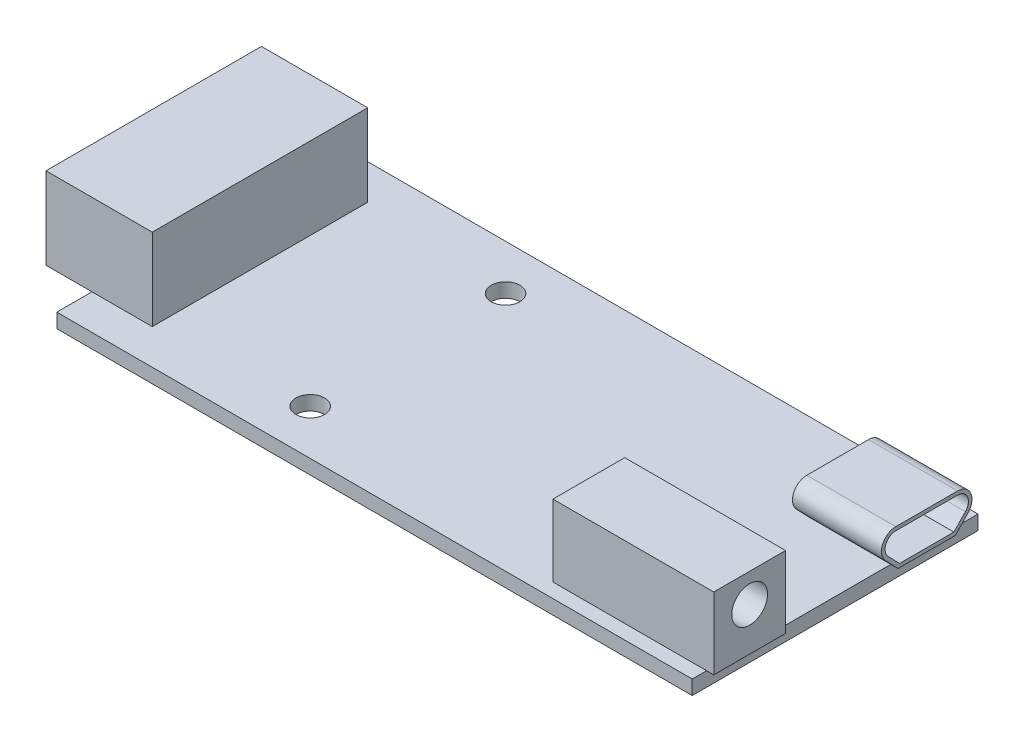
ISO-10303-21;
HEADER;
FILE_DESCRIPTION(('STEP AP214'),'2;1');
FILE_NAME('part.step','',(''),(''),'','','');
FILE_SCHEMA(('AUTOMOTIVE_DESIGN { 1 0 10303 214 1 1 1 1 }'));
ENDSEC;
DATA;
#1=APPLICATION_CONTEXT('core data for automotive mechanical design processes');
#2=APPLICATION_PROTOCOL_DEFINITION('international standard','automotive_design',2000,#1);
#3=PRODUCT_CONTEXT('',#1,'mechanical');
#4=PRODUCT('Part','Part','',(#3));
#5=PRODUCT_RELATED_PRODUCT_CATEGORY('part','',(#4));
#6=PRODUCT_DEFINITION_FORMATION('','',#4);
#7=PRODUCT_DEFINITION_CONTEXT('part definition',#1,'design');
#8=PRODUCT_DEFINITION('design','',#6,#7);
#9=PRODUCT_DEFINITION_SHAPE('','',#8);
#10=(LENGTH_UNIT() NAMED_UNIT(*) SI_UNIT(.MILLI.,.METRE.));
#11=(NAMED_UNIT(*) PLANE_ANGLE_UNIT() SI_UNIT($,.RADIAN.));
#12=(NAMED_UNIT(*) SI_UNIT($,.STERADIAN.) SOLID_ANGLE_UNIT());
#13=UNCERTAINTY_MEASURE_WITH_UNIT(LENGTH_MEASURE(1.E-05),#10,'distance_accuracy_value','');
#14=(GEOMETRIC_REPRESENTATION_CONTEXT(3) GLOBAL_UNCERTAINTY_ASSIGNED_CONTEXT((#13)) GLOBAL_UNIT_ASSIGNED_CONTEXT((#10,
#11,#12)) REPRESENTATION_CONTEXT('',''));
#15=CARTESIAN_POINT('',(0.,0.,0.));
#16=DIRECTION('',(0.,0.,1.));
#17=DIRECTION('',(1.,0.,0.));
#18=AXIS2_PLACEMENT_3D('',#15,#16,#17);
#19=CARTESIAN_POINT('',(0.,1.,0.));
#20=DIRECTION('',(0.,1.,0.));
#21=DIRECTION('',(0.,0.,1.));
#22=AXIS2_PLACEMENT_3D('',#19,#20,#21);
#23=PLANE('',#22);
#24=CARTESIAN_POINT('',(-7.625,1.,-6.8));
#25=DIRECTION('',(0.,1.,0.));
#26=DIRECTION('',(0.,0.,1.));
#27=AXIS2_PLACEMENT_3D('',#24,#25,#26);
#28=CIRCLE('',#27,1.);
#29=CARTESIAN_POINT('',(-7.625,1.,-5.8));
#30=VERTEX_POINT('',#29);
#31=EDGE_CURVE('E464',#30,#30,#28,.T.);
#32=ORIENTED_EDGE('',*,*,#31,.F.);
#33=EDGE_LOOP('',(#32));
#34=FACE_BOUND('',#33,.T.);
#35=CARTESIAN_POINT('',(-7.625,1.,6.8));
#36=DIRECTION('',(0.,1.,0.));
#37=DIRECTION('',(0.,0.,1.));
#38=AXIS2_PLACEMENT_3D('',#35,#36,#37);
#39=CIRCLE('',#38,1.);
#40=CARTESIAN_POINT('',(-7.625,1.,7.8));
#41=VERTEX_POINT('',#40);
#42=EDGE_CURVE('E458',#41,#41,#39,.T.);
#43=ORIENTED_EDGE('',*,*,#42,.F.);
#44=EDGE_LOOP('',(#43));
#45=FACE_BOUND('',#44,.T.);
#46=DIRECTION('',(0.,0.,-1.));
#47=VECTOR('',#46,1.);
#48=CARTESIAN_POINT('',(22.125,1.,9.94999999999999));
#49=LINE('',#48,#47);
#50=CARTESIAN_POINT('',(22.125,1.,3.95));
#51=VERTEX_POINT('',#50);
#52=CARTESIAN_POINT('',(22.125,1.,-3.87916695168533));
#53=VERTEX_POINT('',#52);
#54=EDGE_CURVE('E525',#51,#53,#49,.T.);
#55=ORIENTED_EDGE('',*,*,#54,.T.);
#56=DIRECTION('',(-1.,0.,0.));
#57=VECTOR('',#56,1.);
#58=CARTESIAN_POINT('',(22.625,1.,-3.87916695168533));
#59=LINE('',#58,#57);
#60=CARTESIAN_POINT('',(16.425,1.,-3.87916695168533));
#61=VERTEX_POINT('',#60);
#62=EDGE_CURVE('E69',#53,#61,#59,.T.);
#63=ORIENTED_EDGE('',*,*,#62,.T.);
#64=DIRECTION('',(0.,0.,-1.));
#65=VECTOR('',#64,1.);
#66=CARTESIAN_POINT('',(16.425,1.,-3.87916695168533));
#67=LINE('',#66,#65);
#68=CARTESIAN_POINT('',(16.425,1.,-7.87916695168533));
#69=VERTEX_POINT('',#68);
#70=EDGE_CURVE('E64',#61,#69,#67,.T.);
#71=ORIENTED_EDGE('',*,*,#70,.T.);
#72=DIRECTION('',(-1.,0.,0.));
#73=VECTOR('',#72,1.);
#74=CARTESIAN_POINT('',(22.625,1.,-7.87916695168533));
#75=LINE('',#74,#73);
#76=CARTESIAN_POINT('',(22.125,1.,-7.87916695168533));
#77=VERTEX_POINT('',#76);
#78=EDGE_CURVE('E346',#77,#69,#75,.T.);
#79=ORIENTED_EDGE('',*,*,#78,.F.);
#80=CARTESIAN_POINT('',(22.125,1.,-9.95));
#81=VERTEX_POINT('',#80);
#82=EDGE_CURVE('E477',#77,#81,#49,.T.);
#83=ORIENTED_EDGE('',*,*,#82,.T.);
#84=DIRECTION('',(-1.,0.,0.));
#85=VECTOR('',#84,1.);
#86=CARTESIAN_POINT('',(22.125,1.,-9.95));
#87=LINE('',#86,#85);
#88=CARTESIAN_POINT('',(-22.125,1.,-9.95));
#89=VERTEX_POINT('',#88);
#90=EDGE_CURVE('E481',#81,#89,#87,.T.);
#91=ORIENTED_EDGE('',*,*,#90,.T.);
#92=DIRECTION('',(0.,0.,1.));
#93=VECTOR('',#92,1.);
#94=CARTESIAN_POINT('',(-22.125,1.,9.95));
#95=LINE('',#94,#93);
#96=CARTESIAN_POINT('',(-22.125,1.,-7.49999999999999));
#97=VERTEX_POINT('',#96);
#98=EDGE_CURVE('E470',#89,#97,#95,.T.);
#99=ORIENTED_EDGE('',*,*,#98,.T.);
#100=DIRECTION('',(-1.,0.,0.));
#101=VECTOR('',#100,1.);
#102=CARTESIAN_POINT('',(-25.325,1.,-7.5));
#103=LINE('',#102,#101);
#104=CARTESIAN_POINT('',(-17.925,1.,-7.5));
#105=VERTEX_POINT('',#104);
#106=EDGE_CURVE('E430',#105,#97,#103,.T.);
#107=ORIENTED_EDGE('',*,*,#106,.F.);
#108=DIRECTION('',(0.,0.,-1.));
#109=VECTOR('',#108,1.);
#110=CARTESIAN_POINT('',(-17.925,1.,-7.5));
#111=LINE('',#110,#109);
#112=CARTESIAN_POINT('',(-17.925,1.,7.5));
#113=VERTEX_POINT('',#112);
#114=EDGE_CURVE('E440',#113,#105,#111,.T.);
#115=ORIENTED_EDGE('',*,*,#114,.F.);
#116=DIRECTION('',(1.,0.,0.));
#117=VECTOR('',#116,1.);
#118=CARTESIAN_POINT('',(-25.325,1.,7.5));
#119=LINE('',#118,#117);
#120=CARTESIAN_POINT('',(-22.125,1.,7.5));
#121=VERTEX_POINT('',#120);
#122=EDGE_CURVE('E11',#121,#113,#119,.T.);
#123=ORIENTED_EDGE('',*,*,#122,.F.);
#124=CARTESIAN_POINT('',(-22.125,1.,9.95));
#125=VERTEX_POINT('',#124);
#126=EDGE_CURVE('E475',#121,#125,#95,.T.);
#127=ORIENTED_EDGE('',*,*,#126,.T.);
#128=DIRECTION('',(1.,0.,0.));
#129=VECTOR('',#128,1.);
#130=CARTESIAN_POINT('',(22.125,1.,9.94999999999999));
#131=LINE('',#130,#129);
#132=CARTESIAN_POINT('',(22.125,1.,9.94999999999999));
#133=VERTEX_POINT('',#132);
#134=EDGE_CURVE('E473',#125,#133,#131,.T.);
#135=ORIENTED_EDGE('',*,*,#134,.T.);
#136=CARTESIAN_POINT('',(22.125,1.,8.95));
#137=VERTEX_POINT('',#136);
#138=EDGE_CURVE('E478',#133,#137,#49,.T.);
#139=ORIENTED_EDGE('',*,*,#138,.T.);
#140=DIRECTION('',(1.,0.,0.));
#141=VECTOR('',#140,1.);
#142=CARTESIAN_POINT('',(11.425,1.,8.95));
#143=LINE('',#142,#141);
#144=CARTESIAN_POINT('',(11.425,1.,8.95));
#145=VERTEX_POINT('',#144);
#146=EDGE_CURVE('E374',#145,#137,#143,.T.);
#147=ORIENTED_EDGE('',*,*,#146,.F.);
#148=DIRECTION('',(0.,0.,1.));
#149=VECTOR('',#148,1.);
#150=CARTESIAN_POINT('',(11.425,1.,3.95));
#151=LINE('',#150,#149);
#152=CARTESIAN_POINT('',(11.425,1.,3.95));
#153=VERTEX_POINT('',#152);
#154=EDGE_CURVE('E357',#153,#145,#151,.T.);
#155=ORIENTED_EDGE('',*,*,#154,.F.);
#156=DIRECTION('',(-1.,0.,0.));
#157=VECTOR('',#156,1.);
#158=CARTESIAN_POINT('',(11.425,1.,3.95));
#159=LINE('',#158,#157);
#160=EDGE_CURVE('E379',#51,#153,#159,.T.);
#161=ORIENTED_EDGE('',*,*,#160,.F.);
#162=EDGE_LOOP('',(#55,#63,#71,#79,#83,#91,#99,#107,#115,#123,#127,#135,#139,#147,#155,#161));
#163=FACE_BOUND('',#162,.T.);
#164=ADVANCED_FACE('F47',(#34,#45,#163),#23,.T.);
#165=CARTESIAN_POINT('',(0.,0.,0.));
#166=DIRECTION('',(0.,1.,0.));
#167=DIRECTION('',(0.,0.,1.));
#168=AXIS2_PLACEMENT_3D('',#165,#166,#167);
#169=PLANE('',#168);
#170=DIRECTION('',(0.,0.,1.));
#171=VECTOR('',#170,1.);
#172=CARTESIAN_POINT('',(-22.125,0.,9.95));
#173=LINE('',#172,#171);
#174=CARTESIAN_POINT('',(-22.125,0.,-9.95));
#175=VERTEX_POINT('',#174);
#176=CARTESIAN_POINT('',(-22.125,0.,9.95));
#177=VERTEX_POINT('',#176);
#178=EDGE_CURVE('E467',#175,#177,#173,.T.);
#179=ORIENTED_EDGE('',*,*,#178,.F.);
#180=DIRECTION('',(-1.,0.,0.));
#181=VECTOR('',#180,1.);
#182=CARTESIAN_POINT('',(22.125,0.,-9.95));
#183=LINE('',#182,#181);
#184=CARTESIAN_POINT('',(22.125,0.,-9.95));
#185=VERTEX_POINT('',#184);
#186=EDGE_CURVE('E491',#185,#175,#183,.T.);
#187=ORIENTED_EDGE('',*,*,#186,.F.);
#188=DIRECTION('',(0.,0.,-1.));
#189=VECTOR('',#188,1.);
#190=CARTESIAN_POINT('',(22.125,0.,9.94999999999999));
#191=LINE('',#190,#189);
#192=CARTESIAN_POINT('',(22.125,0.,9.94999999999999));
#193=VERTEX_POINT('',#192);
#194=EDGE_CURVE('E489',#193,#185,#191,.T.);
#195=ORIENTED_EDGE('',*,*,#194,.F.);
#196=DIRECTION('',(1.,0.,0.));
#197=VECTOR('',#196,1.);
#198=CARTESIAN_POINT('',(22.125,0.,9.94999999999999));
#199=LINE('',#198,#197);
#200=EDGE_CURVE('E487',#177,#193,#199,.T.);
#201=ORIENTED_EDGE('',*,*,#200,.F.);
#202=EDGE_LOOP('',(#179,#187,#195,#201));
#203=FACE_BOUND('',#202,.T.);
#204=CARTESIAN_POINT('',(-7.625,0.,-6.8));
#205=DIRECTION('',(0.,1.,0.));
#206=DIRECTION('',(0.,0.,1.));
#207=AXIS2_PLACEMENT_3D('',#204,#205,#206);
#208=CIRCLE('',#207,1.);
#209=CARTESIAN_POINT('',(-7.625,0.,-5.8));
#210=VERTEX_POINT('',#209);
#211=EDGE_CURVE('E461',#210,#210,#208,.T.);
#212=ORIENTED_EDGE('',*,*,#211,.T.);
#213=EDGE_LOOP('',(#212));
#214=FACE_BOUND('',#213,.T.);
#215=CARTESIAN_POINT('',(-7.625,0.,6.8));
#216=DIRECTION('',(0.,1.,0.));
#217=DIRECTION('',(0.,0.,1.));
#218=AXIS2_PLACEMENT_3D('',#215,#216,#217);
#219=CIRCLE('',#218,1.);
#220=CARTESIAN_POINT('',(-7.625,0.,7.8));
#221=VERTEX_POINT('',#220);
#222=EDGE_CURVE('E457',#221,#221,#219,.T.);
#223=ORIENTED_EDGE('',*,*,#222,.T.);
#224=EDGE_LOOP('',(#223));
#225=FACE_BOUND('',#224,.T.);
#226=ADVANCED_FACE('F515',(#203,#214,#225),#169,.F.);
#227=CARTESIAN_POINT('',(-22.125,1.,9.95));
#228=DIRECTION('',(1.,0.,0.));
#229=DIRECTION('',(0.,0.,-1.));
#230=AXIS2_PLACEMENT_3D('',#227,#228,#229);
#231=PLANE('',#230);
#232=ORIENTED_EDGE('',*,*,#178,.T.);
#233=DIRECTION('',(0.,-1.,0.));
#234=VECTOR('',#233,1.);
#235=CARTESIAN_POINT('',(-22.125,1.,9.95));
#236=LINE('',#235,#234);
#237=EDGE_CURVE('E51',#125,#177,#236,.T.);
#238=ORIENTED_EDGE('',*,*,#237,.F.);
#239=ORIENTED_EDGE('',*,*,#126,.F.);
#240=EDGE_CURVE('E474',#97,#121,#95,.T.);
#241=ORIENTED_EDGE('',*,*,#240,.F.);
#242=ORIENTED_EDGE('',*,*,#98,.F.);
#243=DIRECTION('',(0.,-1.,0.));
#244=VECTOR('',#243,1.);
#245=CARTESIAN_POINT('',(-22.125,1.,-9.95));
#246=LINE('',#245,#244);
#247=EDGE_CURVE('E484',#89,#175,#246,.T.);
#248=ORIENTED_EDGE('',*,*,#247,.T.);
#249=EDGE_LOOP('',(#232,#238,#239,#241,#242,#248));
#250=FACE_BOUND('',#249,.T.);
#251=ADVANCED_FACE('F49',(#250),#231,.F.);
#252=CARTESIAN_POINT('',(22.125,1.,9.94999999999999));
#253=DIRECTION('',(0.,0.,-1.));
#254=DIRECTION('',(-1.,0.,0.));
#255=AXIS2_PLACEMENT_3D('',#252,#253,#254);
#256=PLANE('',#255);
#257=ORIENTED_EDGE('',*,*,#200,.T.);
#258=DIRECTION('',(0.,-1.,0.));
#259=VECTOR('',#258,1.);
#260=CARTESIAN_POINT('',(22.125,1.,9.94999999999999));
#261=LINE('',#260,#259);
#262=EDGE_CURVE('E497',#133,#193,#261,.T.);
#263=ORIENTED_EDGE('',*,*,#262,.F.);
#264=ORIENTED_EDGE('',*,*,#134,.F.);
#265=ORIENTED_EDGE('',*,*,#237,.T.);
#266=EDGE_LOOP('',(#257,#263,#264,#265));
#267=FACE_BOUND('',#266,.T.);
#268=ADVANCED_FACE('F507',(#267),#256,.F.);
#269=CARTESIAN_POINT('',(22.125,1.,9.94999999999999));
#270=DIRECTION('',(-1.,0.,0.));
#271=DIRECTION('',(0.,0.,1.));
#272=AXIS2_PLACEMENT_3D('',#269,#270,#271);
#273=PLANE('',#272);
#274=ORIENTED_EDGE('',*,*,#194,.T.);
#275=DIRECTION('',(0.,-1.,0.));
#276=VECTOR('',#275,1.);
#277=CARTESIAN_POINT('',(22.125,1.,-9.95));
#278=LINE('',#277,#276);
#279=EDGE_CURVE('E495',#81,#185,#278,.T.);
#280=ORIENTED_EDGE('',*,*,#279,.F.);
#281=ORIENTED_EDGE('',*,*,#82,.F.);
#282=EDGE_CURVE('E524',#53,#77,#49,.T.);
#283=ORIENTED_EDGE('',*,*,#282,.F.);
#284=ORIENTED_EDGE('',*,*,#54,.F.);
#285=EDGE_CURVE('E482',#137,#51,#49,.T.);
#286=ORIENTED_EDGE('',*,*,#285,.F.);
#287=ORIENTED_EDGE('',*,*,#138,.F.);
#288=ORIENTED_EDGE('',*,*,#262,.T.);
#289=EDGE_LOOP('',(#274,#280,#281,#283,#284,#286,#287,#288));
#290=FACE_BOUND('',#289,.T.);
#291=ADVANCED_FACE('F518',(#290),#273,.F.);
#292=CARTESIAN_POINT('',(22.125,1.,-9.95));
#293=DIRECTION('',(0.,0.,1.));
#294=DIRECTION('',(1.,0.,0.));
#295=AXIS2_PLACEMENT_3D('',#292,#293,#294);
#296=PLANE('',#295);
#297=ORIENTED_EDGE('',*,*,#186,.T.);
#298=ORIENTED_EDGE('',*,*,#247,.F.);
#299=ORIENTED_EDGE('',*,*,#90,.F.);
#300=ORIENTED_EDGE('',*,*,#279,.T.);
#301=EDGE_LOOP('',(#297,#298,#299,#300));
#302=FACE_BOUND('',#301,.T.);
#303=ADVANCED_FACE('F521',(#302),#296,.F.);
#304=CARTESIAN_POINT('',(-7.625,1.,-6.8));
#305=DIRECTION('',(0.,-1.,0.));
#306=DIRECTION('',(0.,0.,-1.));
#307=AXIS2_PLACEMENT_3D('',#304,#305,#306);
#308=CYLINDRICAL_SURFACE('',#307,1.);
#309=ORIENTED_EDGE('',*,*,#31,.T.);
#310=EDGE_LOOP('',(#309));
#311=FACE_BOUND('',#310,.T.);
#312=ORIENTED_EDGE('',*,*,#211,.F.);
#313=EDGE_LOOP('',(#312));
#314=FACE_BOUND('',#313,.T.);
#315=ADVANCED_FACE('F591',(#311,#314),#308,.F.);
#316=CARTESIAN_POINT('',(-7.625,1.,6.8));
#317=DIRECTION('',(0.,-1.,0.));
#318=DIRECTION('',(0.,0.,-1.));
#319=AXIS2_PLACEMENT_3D('',#316,#317,#318);
#320=CYLINDRICAL_SURFACE('',#319,1.);
#321=ORIENTED_EDGE('',*,*,#42,.T.);
#322=EDGE_LOOP('',(#321));
#323=FACE_BOUND('',#322,.T.);
#324=ORIENTED_EDGE('',*,*,#222,.F.);
#325=EDGE_LOOP('',(#324));
#326=FACE_BOUND('',#325,.T.);
#327=ADVANCED_FACE('F941',(#323,#326),#320,.F.);
#328=CARTESIAN_POINT('',(0.,1.,0.));
#329=DIRECTION('',(0.,1.,0.));
#330=DIRECTION('',(0.,0.,1.));
#331=AXIS2_PLACEMENT_3D('',#328,#329,#330);
#332=PLANE('',#331);
#333=CARTESIAN_POINT('',(-25.325,1.,-7.5));
#334=VERTEX_POINT('',#333);
#335=EDGE_CURVE('E443',#97,#334,#103,.T.);
#336=ORIENTED_EDGE('',*,*,#335,.F.);
#337=ORIENTED_EDGE('',*,*,#240,.T.);
#338=CARTESIAN_POINT('',(-25.325,1.,7.5));
#339=VERTEX_POINT('',#338);
#340=EDGE_CURVE('E57',#339,#121,#119,.T.);
#341=ORIENTED_EDGE('',*,*,#340,.F.);
#342=DIRECTION('',(0.,0.,1.));
#343=VECTOR('',#342,1.);
#344=CARTESIAN_POINT('',(-25.325,1.,-7.5));
#345=LINE('',#344,#343);
#346=EDGE_CURVE('E419',#334,#339,#345,.T.);
#347=ORIENTED_EDGE('',*,*,#346,.F.);
#348=EDGE_LOOP('',(#336,#337,#341,#347));
#349=FACE_BOUND('',#348,.T.);
#350=ADVANCED_FACE('F550',(#349),#332,.F.);
#351=CARTESIAN_POINT('',(-25.325,6.7,-7.5));
#352=DIRECTION('',(1.,0.,0.));
#353=DIRECTION('',(0.,0.,-1.));
#354=AXIS2_PLACEMENT_3D('',#351,#352,#353);
#355=PLANE('',#354);
#356=DIRECTION('',(0.,0.,1.));
#357=VECTOR('',#356,1.);
#358=CARTESIAN_POINT('',(-25.325,1.7,-6.8));
#359=LINE('',#358,#357);
#360=CARTESIAN_POINT('',(-25.325,1.7,-6.8));
#361=VERTEX_POINT('',#360);
#362=CARTESIAN_POINT('',(-25.325,1.7,6.8));
#363=VERTEX_POINT('',#362);
#364=EDGE_CURVE('E409',#361,#363,#359,.T.);
#365=ORIENTED_EDGE('',*,*,#364,.F.);
#366=DIRECTION('',(0.,-1.,0.));
#367=VECTOR('',#366,1.);
#368=CARTESIAN_POINT('',(-25.325,6.,-6.8));
#369=LINE('',#368,#367);
#370=CARTESIAN_POINT('',(-25.325,6.,-6.8));
#371=VERTEX_POINT('',#370);
#372=EDGE_CURVE('E393',#371,#361,#369,.T.);
#373=ORIENTED_EDGE('',*,*,#372,.F.);
#374=DIRECTION('',(0.,0.,-1.));
#375=VECTOR('',#374,1.);
#376=CARTESIAN_POINT('',(-25.325,6.,-6.8));
#377=LINE('',#376,#375);
#378=CARTESIAN_POINT('',(-25.325,6.,6.8));
#379=VERTEX_POINT('',#378);
#380=EDGE_CURVE('E398',#379,#371,#377,.T.);
#381=ORIENTED_EDGE('',*,*,#380,.F.);
#382=DIRECTION('',(0.,1.,0.));
#383=VECTOR('',#382,1.);
#384=CARTESIAN_POINT('',(-25.325,6.,6.8));
#385=LINE('',#384,#383);
#386=EDGE_CURVE('E412',#363,#379,#385,.T.);
#387=ORIENTED_EDGE('',*,*,#386,.F.);
#388=EDGE_LOOP('',(#365,#373,#381,#387));
#389=FACE_BOUND('',#388,.T.);
#390=ORIENTED_EDGE('',*,*,#346,.T.);
#391=DIRECTION('',(0.,-1.,0.));
#392=VECTOR('',#391,1.);
#393=CARTESIAN_POINT('',(-25.325,6.7,7.5));
#394=LINE('',#393,#392);
#395=CARTESIAN_POINT('',(-25.325,6.7,7.5));
#396=VERTEX_POINT('',#395);
#397=EDGE_CURVE('E454',#396,#339,#394,.T.);
#398=ORIENTED_EDGE('',*,*,#397,.F.);
#399=DIRECTION('',(0.,0.,1.));
#400=VECTOR('',#399,1.);
#401=CARTESIAN_POINT('',(-25.325,6.7,-7.5));
#402=LINE('',#401,#400);
#403=CARTESIAN_POINT('',(-25.325,6.7,-7.5));
#404=VERTEX_POINT('',#403);
#405=EDGE_CURVE('E426',#404,#396,#402,.T.);
#406=ORIENTED_EDGE('',*,*,#405,.F.);
#407=DIRECTION('',(0.,-1.,0.));
#408=VECTOR('',#407,1.);
#409=CARTESIAN_POINT('',(-25.325,6.7,-7.5));
#410=LINE('',#409,#408);
#411=EDGE_CURVE('E436',#404,#334,#410,.T.);
#412=ORIENTED_EDGE('',*,*,#411,.T.);
#413=EDGE_LOOP('',(#390,#398,#406,#412));
#414=FACE_BOUND('',#413,.T.);
#415=ADVANCED_FACE('F558',(#389,#414),#355,.F.);
#416=CARTESIAN_POINT('',(-25.325,6.7,7.5));
#417=DIRECTION('',(0.,0.,-1.));
#418=DIRECTION('',(-1.,0.,0.));
#419=AXIS2_PLACEMENT_3D('',#416,#417,#418);
#420=PLANE('',#419);
#421=ORIENTED_EDGE('',*,*,#340,.T.);
#422=ORIENTED_EDGE('',*,*,#122,.T.);
#423=DIRECTION('',(0.,-1.,0.));
#424=VECTOR('',#423,1.);
#425=CARTESIAN_POINT('',(-17.925,6.7,7.5));
#426=LINE('',#425,#424);
#427=CARTESIAN_POINT('',(-17.925,6.7,7.5));
#428=VERTEX_POINT('',#427);
#429=EDGE_CURVE('E451',#428,#113,#426,.T.);
#430=ORIENTED_EDGE('',*,*,#429,.F.);
#431=DIRECTION('',(1.,0.,0.));
#432=VECTOR('',#431,1.);
#433=CARTESIAN_POINT('',(-25.325,6.7,7.5));
#434=LINE('',#433,#432);
#435=EDGE_CURVE('E429',#396,#428,#434,.T.);
#436=ORIENTED_EDGE('',*,*,#435,.F.);
#437=ORIENTED_EDGE('',*,*,#397,.T.);
#438=EDGE_LOOP('',(#421,#422,#430,#436,#437));
#439=FACE_BOUND('',#438,.T.);
#440=ADVANCED_FACE('F553',(#439),#420,.F.);
#441=CARTESIAN_POINT('',(-17.925,6.7,-7.5));
#442=DIRECTION('',(-1.,0.,0.));
#443=DIRECTION('',(0.,0.,1.));
#444=AXIS2_PLACEMENT_3D('',#441,#442,#443);
#445=PLANE('',#444);
#446=ORIENTED_EDGE('',*,*,#114,.T.);
#447=DIRECTION('',(0.,-1.,0.));
#448=VECTOR('',#447,1.);
#449=CARTESIAN_POINT('',(-17.925,6.7,-7.5));
#450=LINE('',#449,#448);
#451=CARTESIAN_POINT('',(-17.925,6.7,-7.5));
#452=VERTEX_POINT('',#451);
#453=EDGE_CURVE('E448',#452,#105,#450,.T.);
#454=ORIENTED_EDGE('',*,*,#453,.F.);
#455=DIRECTION('',(0.,0.,-1.));
#456=VECTOR('',#455,1.);
#457=CARTESIAN_POINT('',(-17.925,6.7,-7.5));
#458=LINE('',#457,#456);
#459=EDGE_CURVE('E432',#428,#452,#458,.T.);
#460=ORIENTED_EDGE('',*,*,#459,.F.);
#461=ORIENTED_EDGE('',*,*,#429,.T.);
#462=EDGE_LOOP('',(#446,#454,#460,#461));
#463=FACE_BOUND('',#462,.T.);
#464=ADVANCED_FACE('F565',(#463),#445,.F.);
#465=CARTESIAN_POINT('',(-25.325,6.7,-7.5));
#466=DIRECTION('',(0.,0.,1.));
#467=DIRECTION('',(1.,0.,0.));
#468=AXIS2_PLACEMENT_3D('',#465,#466,#467);
#469=PLANE('',#468);
#470=ORIENTED_EDGE('',*,*,#106,.T.);
#471=ORIENTED_EDGE('',*,*,#335,.T.);
#472=ORIENTED_EDGE('',*,*,#411,.F.);
#473=DIRECTION('',(-1.,0.,0.));
#474=VECTOR('',#473,1.);
#475=CARTESIAN_POINT('',(-25.325,6.7,-7.5));
#476=LINE('',#475,#474);
#477=EDGE_CURVE('E434',#452,#404,#476,.T.);
#478=ORIENTED_EDGE('',*,*,#477,.F.);
#479=ORIENTED_EDGE('',*,*,#453,.T.);
#480=EDGE_LOOP('',(#470,#471,#472,#478,#479));
#481=FACE_BOUND('',#480,.T.);
#482=ADVANCED_FACE('F562',(#481),#469,.F.);
#483=CARTESIAN_POINT('',(0.,6.7,0.));
#484=DIRECTION('',(0.,1.,0.));
#485=DIRECTION('',(0.,0.,1.));
#486=AXIS2_PLACEMENT_3D('',#483,#484,#485);
#487=PLANE('',#486);
#488=ORIENTED_EDGE('',*,*,#405,.T.);
#489=ORIENTED_EDGE('',*,*,#435,.T.);
#490=ORIENTED_EDGE('',*,*,#459,.T.);
#491=ORIENTED_EDGE('',*,*,#477,.T.);
#492=EDGE_LOOP('',(#488,#489,#490,#491));
#493=FACE_BOUND('',#492,.T.);
#494=ADVANCED_FACE('F568',(#493),#487,.T.);
#495=CARTESIAN_POINT('',(-19.325,6.,-6.8));
#496=DIRECTION('',(0.,0.,-1.));
#497=DIRECTION('',(-1.,0.,0.));
#498=AXIS2_PLACEMENT_3D('',#495,#496,#497);
#499=PLANE('',#498);
#500=ORIENTED_EDGE('',*,*,#372,.T.);
#501=DIRECTION('',(-1.,0.,0.));
#502=VECTOR('',#501,1.);
#503=CARTESIAN_POINT('',(-19.325,1.7,-6.8));
#504=LINE('',#503,#502);
#505=CARTESIAN_POINT('',(-19.325,1.7,-6.8));
#506=VERTEX_POINT('',#505);
#507=EDGE_CURVE('E407',#506,#361,#504,.T.);
#508=ORIENTED_EDGE('',*,*,#507,.F.);
#509=DIRECTION('',(0.,-1.,0.));
#510=VECTOR('',#509,1.);
#511=CARTESIAN_POINT('',(-19.325,6.,-6.8));
#512=LINE('',#511,#510);
#513=CARTESIAN_POINT('',(-19.325,6.,-6.8));
#514=VERTEX_POINT('',#513);
#515=EDGE_CURVE('E394',#514,#506,#512,.T.);
#516=ORIENTED_EDGE('',*,*,#515,.F.);
#517=DIRECTION('',(-1.,0.,0.));
#518=VECTOR('',#517,1.);
#519=CARTESIAN_POINT('',(-19.325,6.,-6.8));
#520=LINE('',#519,#518);
#521=EDGE_CURVE('E417',#514,#371,#520,.T.);
#522=ORIENTED_EDGE('',*,*,#521,.T.);
#523=EDGE_LOOP('',(#500,#508,#516,#522));
#524=FACE_BOUND('',#523,.T.);
#525=ADVANCED_FACE('F570',(#524),#499,.F.);
#526=CARTESIAN_POINT('',(-19.325,6.,-6.8));
#527=DIRECTION('',(0.,1.,0.));
#528=DIRECTION('',(0.,0.,1.));
#529=AXIS2_PLACEMENT_3D('',#526,#527,#528);
#530=PLANE('',#529);
#531=ORIENTED_EDGE('',*,*,#380,.T.);
#532=ORIENTED_EDGE('',*,*,#521,.F.);
#533=DIRECTION('',(0.,0.,-1.));
#534=VECTOR('',#533,1.);
#535=CARTESIAN_POINT('',(-19.325,6.,-6.8));
#536=LINE('',#535,#534);
#537=CARTESIAN_POINT('',(-19.325,6.,6.8));
#538=VERTEX_POINT('',#537);
#539=EDGE_CURVE('E404',#538,#514,#536,.T.);
#540=ORIENTED_EDGE('',*,*,#539,.F.);
#541=DIRECTION('',(-1.,0.,0.));
#542=VECTOR('',#541,1.);
#543=CARTESIAN_POINT('',(-19.325,6.,6.8));
#544=LINE('',#543,#542);
#545=EDGE_CURVE('E420',#538,#379,#544,.T.);
#546=ORIENTED_EDGE('',*,*,#545,.T.);
#547=EDGE_LOOP('',(#531,#532,#540,#546));
#548=FACE_BOUND('',#547,.T.);
#549=ADVANCED_FACE('F576',(#548),#530,.F.);
#550=CARTESIAN_POINT('',(-19.325,6.,6.8));
#551=DIRECTION('',(0.,0.,1.));
#552=DIRECTION('',(1.,0.,0.));
#553=AXIS2_PLACEMENT_3D('',#550,#551,#552);
#554=PLANE('',#553);
#555=ORIENTED_EDGE('',*,*,#386,.T.);
#556=ORIENTED_EDGE('',*,*,#545,.F.);
#557=DIRECTION('',(0.,1.,0.));
#558=VECTOR('',#557,1.);
#559=CARTESIAN_POINT('',(-19.325,6.,6.8));
#560=LINE('',#559,#558);
#561=CARTESIAN_POINT('',(-19.325,1.7,6.8));
#562=VERTEX_POINT('',#561);
#563=EDGE_CURVE('E401',#562,#538,#560,.T.);
#564=ORIENTED_EDGE('',*,*,#563,.F.);
#565=DIRECTION('',(-1.,0.,0.));
#566=VECTOR('',#565,1.);
#567=CARTESIAN_POINT('',(-19.325,1.7,6.8));
#568=LINE('',#567,#566);
#569=EDGE_CURVE('E422',#562,#363,#568,.T.);
#570=ORIENTED_EDGE('',*,*,#569,.T.);
#571=EDGE_LOOP('',(#555,#556,#564,#570));
#572=FACE_BOUND('',#571,.T.);
#573=ADVANCED_FACE('F877',(#572),#554,.F.);
#574=CARTESIAN_POINT('',(-19.325,1.7,-6.8));
#575=DIRECTION('',(0.,-1.,0.));
#576=DIRECTION('',(0.,0.,-1.));
#577=AXIS2_PLACEMENT_3D('',#574,#575,#576);
#578=PLANE('',#577);
#579=ORIENTED_EDGE('',*,*,#364,.T.);
#580=ORIENTED_EDGE('',*,*,#569,.F.);
#581=DIRECTION('',(0.,0.,1.));
#582=VECTOR('',#581,1.);
#583=CARTESIAN_POINT('',(-19.325,1.7,-6.8));
#584=LINE('',#583,#582);
#585=EDGE_CURVE('E397',#506,#562,#584,.T.);
#586=ORIENTED_EDGE('',*,*,#585,.F.);
#587=ORIENTED_EDGE('',*,*,#507,.T.);
#588=EDGE_LOOP('',(#579,#580,#586,#587));
#589=FACE_BOUND('',#588,.T.);
#590=ADVANCED_FACE('F869',(#589),#578,.F.);
#591=CARTESIAN_POINT('',(-19.325,0.,0.));
#592=DIRECTION('',(-1.,0.,0.));
#593=DIRECTION('',(0.,0.,1.));
#594=AXIS2_PLACEMENT_3D('',#591,#592,#593);
#595=PLANE('',#594);
#596=ORIENTED_EDGE('',*,*,#515,.T.);
#597=ORIENTED_EDGE('',*,*,#585,.T.);
#598=ORIENTED_EDGE('',*,*,#563,.T.);
#599=ORIENTED_EDGE('',*,*,#539,.T.);
#600=EDGE_LOOP('',(#596,#597,#598,#599));
#601=FACE_BOUND('',#600,.T.);
#602=ADVANCED_FACE('F862',(#601),#595,.T.);
#603=CARTESIAN_POINT('',(0.,1.,0.));
#604=DIRECTION('',(0.,1.,0.));
#605=DIRECTION('',(0.,0.,1.));
#606=AXIS2_PLACEMENT_3D('',#603,#604,#605);
#607=PLANE('',#606);
#608=CARTESIAN_POINT('',(22.625,1.,8.95));
#609=VERTEX_POINT('',#608);
#610=EDGE_CURVE('E373',#137,#609,#143,.T.);
#611=ORIENTED_EDGE('',*,*,#610,.F.);
#612=ORIENTED_EDGE('',*,*,#285,.T.);
#613=CARTESIAN_POINT('',(22.625,1.,3.95));
#614=VERTEX_POINT('',#613);
#615=EDGE_CURVE('E364',#614,#51,#159,.T.);
#616=ORIENTED_EDGE('',*,*,#615,.F.);
#617=DIRECTION('',(0.,0.,-1.));
#618=VECTOR('',#617,1.);
#619=CARTESIAN_POINT('',(22.625,1.,3.95));
#620=LINE('',#619,#618);
#621=EDGE_CURVE('E377',#609,#614,#620,.T.);
#622=ORIENTED_EDGE('',*,*,#621,.F.);
#623=EDGE_LOOP('',(#611,#612,#616,#622));
#624=FACE_BOUND('',#623,.T.);
#625=ADVANCED_FACE('F533',(#624),#607,.F.);
#626=CARTESIAN_POINT('',(11.425,6.,3.95));
#627=DIRECTION('',(1.,0.,0.));
#628=DIRECTION('',(0.,0.,-1.));
#629=AXIS2_PLACEMENT_3D('',#626,#627,#628);
#630=PLANE('',#629);
#631=ORIENTED_EDGE('',*,*,#154,.T.);
#632=DIRECTION('',(0.,-1.,0.));
#633=VECTOR('',#632,1.);
#634=CARTESIAN_POINT('',(11.425,6.,8.95));
#635=LINE('',#634,#633);
#636=CARTESIAN_POINT('',(11.425,6.,8.95));
#637=VERTEX_POINT('',#636);
#638=EDGE_CURVE('E390',#637,#145,#635,.T.);
#639=ORIENTED_EDGE('',*,*,#638,.F.);
#640=DIRECTION('',(0.,0.,1.));
#641=VECTOR('',#640,1.);
#642=CARTESIAN_POINT('',(11.425,6.,3.95));
#643=LINE('',#642,#641);
#644=CARTESIAN_POINT('',(11.425,6.,3.95));
#645=VERTEX_POINT('',#644);
#646=EDGE_CURVE('E360',#645,#637,#643,.T.);
#647=ORIENTED_EDGE('',*,*,#646,.F.);
#648=DIRECTION('',(0.,-1.,0.));
#649=VECTOR('',#648,1.);
#650=CARTESIAN_POINT('',(11.425,6.,3.95));
#651=LINE('',#650,#649);
#652=EDGE_CURVE('E370',#645,#153,#651,.T.);
#653=ORIENTED_EDGE('',*,*,#652,.T.);
#654=EDGE_LOOP('',(#631,#639,#647,#653));
#655=FACE_BOUND('',#654,.T.);
#656=ADVANCED_FACE('F848',(#655),#630,.F.);
#657=CARTESIAN_POINT('',(11.425,6.,8.95));
#658=DIRECTION('',(0.,0.,-1.));
#659=DIRECTION('',(-1.,0.,0.));
#660=AXIS2_PLACEMENT_3D('',#657,#658,#659);
#661=PLANE('',#660);
#662=ORIENTED_EDGE('',*,*,#146,.T.);
#663=ORIENTED_EDGE('',*,*,#610,.T.);
#664=DIRECTION('',(0.,-1.,0.));
#665=VECTOR('',#664,1.);
#666=CARTESIAN_POINT('',(22.625,6.,8.95));
#667=LINE('',#666,#665);
#668=CARTESIAN_POINT('',(22.625,6.,8.95));
#669=VERTEX_POINT('',#668);
#670=EDGE_CURVE('E387',#669,#609,#667,.T.);
#671=ORIENTED_EDGE('',*,*,#670,.F.);
#672=DIRECTION('',(1.,0.,0.));
#673=VECTOR('',#672,1.);
#674=CARTESIAN_POINT('',(11.425,6.,8.95));
#675=LINE('',#674,#673);
#676=EDGE_CURVE('E363',#637,#669,#675,.T.);
#677=ORIENTED_EDGE('',*,*,#676,.F.);
#678=ORIENTED_EDGE('',*,*,#638,.T.);
#679=EDGE_LOOP('',(#662,#663,#671,#677,#678));
#680=FACE_BOUND('',#679,.T.);
#681=ADVANCED_FACE('F546',(#680),#661,.F.);
#682=CARTESIAN_POINT('',(22.625,6.,3.95));
#683=DIRECTION('',(-1.,0.,0.));
#684=DIRECTION('',(0.,0.,1.));
#685=AXIS2_PLACEMENT_3D('',#682,#683,#684);
#686=PLANE('',#685);
#687=CARTESIAN_POINT('',(22.625,4.,6.45));
#688=DIRECTION('',(1.,0.,0.));
#689=DIRECTION('',(0.,0.,-1.));
#690=AXIS2_PLACEMENT_3D('',#687,#688,#689);
#691=CIRCLE('',#690,1.25);
#692=CARTESIAN_POINT('',(22.625,4.,5.2));
#693=VERTEX_POINT('',#692);
#694=EDGE_CURVE('E353',#693,#693,#691,.T.);
#695=ORIENTED_EDGE('',*,*,#694,.F.);
#696=EDGE_LOOP('',(#695));
#697=FACE_BOUND('',#696,.T.);
#698=ORIENTED_EDGE('',*,*,#621,.T.);
#699=DIRECTION('',(0.,-1.,0.));
#700=VECTOR('',#699,1.);
#701=CARTESIAN_POINT('',(22.625,6.,3.95));
#702=LINE('',#701,#700);
#703=CARTESIAN_POINT('',(22.625,6.,3.95));
#704=VERTEX_POINT('',#703);
#705=EDGE_CURVE('E384',#704,#614,#702,.T.);
#706=ORIENTED_EDGE('',*,*,#705,.F.);
#707=DIRECTION('',(0.,0.,-1.));
#708=VECTOR('',#707,1.);
#709=CARTESIAN_POINT('',(22.625,6.,3.95));
#710=LINE('',#709,#708);
#711=EDGE_CURVE('E366',#669,#704,#710,.T.);
#712=ORIENTED_EDGE('',*,*,#711,.F.);
#713=ORIENTED_EDGE('',*,*,#670,.T.);
#714=EDGE_LOOP('',(#698,#706,#712,#713));
#715=FACE_BOUND('',#714,.T.);
#716=ADVANCED_FACE('F543',(#697,#715),#686,.F.);
#717=CARTESIAN_POINT('',(11.425,6.,3.95));
#718=DIRECTION('',(0.,0.,1.));
#719=DIRECTION('',(1.,0.,0.));
#720=AXIS2_PLACEMENT_3D('',#717,#718,#719);
#721=PLANE('',#720);
#722=ORIENTED_EDGE('',*,*,#615,.T.);
#723=ORIENTED_EDGE('',*,*,#160,.T.);
#724=ORIENTED_EDGE('',*,*,#652,.F.);
#725=DIRECTION('',(-1.,0.,0.));
#726=VECTOR('',#725,1.);
#727=CARTESIAN_POINT('',(11.425,6.,3.95));
#728=LINE('',#727,#726);
#729=EDGE_CURVE('E368',#704,#645,#728,.T.);
#730=ORIENTED_EDGE('',*,*,#729,.F.);
#731=ORIENTED_EDGE('',*,*,#705,.T.);
#732=EDGE_LOOP('',(#722,#723,#724,#730,#731));
#733=FACE_BOUND('',#732,.T.);
#734=ADVANCED_FACE('F537',(#733),#721,.F.);
#735=CARTESIAN_POINT('',(0.,6.,0.));
#736=DIRECTION('',(0.,1.,0.));
#737=DIRECTION('',(0.,0.,1.));
#738=AXIS2_PLACEMENT_3D('',#735,#736,#737);
#739=PLANE('',#738);
#740=ORIENTED_EDGE('',*,*,#646,.T.);
#741=ORIENTED_EDGE('',*,*,#676,.T.);
#742=ORIENTED_EDGE('',*,*,#711,.T.);
#743=ORIENTED_EDGE('',*,*,#729,.T.);
#744=EDGE_LOOP('',(#740,#741,#742,#743));
#745=FACE_BOUND('',#744,.T.);
#746=ADVANCED_FACE('F821',(#745),#739,.T.);
#747=CARTESIAN_POINT('',(14.625,4.,6.45));
#748=DIRECTION('',(1.,0.,0.));
#749=DIRECTION('',(0.,0.,-1.));
#750=AXIS2_PLACEMENT_3D('',#747,#748,#749);
#751=CYLINDRICAL_SURFACE('',#750,1.25);
#752=CARTESIAN_POINT('',(14.625,4.,6.45));
#753=DIRECTION('',(1.,0.,0.));
#754=DIRECTION('',(0.,0.,-1.));
#755=AXIS2_PLACEMENT_3D('',#752,#753,#754);
#756=CIRCLE('',#755,1.25);
#757=CARTESIAN_POINT('',(14.625,4.,5.2));
#758=VERTEX_POINT('',#757);
#759=EDGE_CURVE('E354',#758,#758,#756,.T.);
#760=ORIENTED_EDGE('',*,*,#759,.F.);
#761=EDGE_LOOP('',(#760));
#762=FACE_BOUND('',#761,.T.);
#763=ORIENTED_EDGE('',*,*,#694,.T.);
#764=EDGE_LOOP('',(#763));
#765=FACE_BOUND('',#764,.T.);
#766=ADVANCED_FACE('F814',(#762,#765),#751,.F.);
#767=CARTESIAN_POINT('',(14.625,4.,6.45));
#768=DIRECTION('',(1.,0.,0.));
#769=DIRECTION('',(0.,0.,-1.));
#770=AXIS2_PLACEMENT_3D('',#767,#768,#769);
#771=PLANE('',#770);
#772=ORIENTED_EDGE('',*,*,#759,.T.);
#773=EDGE_LOOP('',(#772));
#774=FACE_BOUND('',#773,.T.);
#775=ADVANCED_FACE('F623',(#774),#771,.T.);
#776=CARTESIAN_POINT('',(22.625,1.,-3.87916695168533));
#777=DIRECTION('',(0.,1.,0.));
#778=DIRECTION('',(0.,0.,1.));
#779=AXIS2_PLACEMENT_3D('',#776,#777,#778);
#780=PLANE('',#779);
#781=CARTESIAN_POINT('',(22.625,1.,-3.87916695168533));
#782=VERTEX_POINT('',#781);
#783=EDGE_CURVE('E350',#782,#53,#59,.T.);
#784=ORIENTED_EDGE('',*,*,#783,.T.);
#785=ORIENTED_EDGE('',*,*,#282,.T.);
#786=CARTESIAN_POINT('',(22.625,1.,-7.87916695168533));
#787=VERTEX_POINT('',#786);
#788=EDGE_CURVE('E347',#787,#77,#75,.T.);
#789=ORIENTED_EDGE('',*,*,#788,.F.);
#790=DIRECTION('',(0.,0.,-1.));
#791=VECTOR('',#790,1.);
#792=CARTESIAN_POINT('',(22.625,1.,-3.87916695168533));
#793=LINE('',#792,#791);
#794=EDGE_CURVE('E328',#782,#787,#793,.T.);
#795=ORIENTED_EDGE('',*,*,#794,.F.);
#796=EDGE_LOOP('',(#784,#785,#789,#795));
#797=FACE_BOUND('',#796,.T.);
#798=ADVANCED_FACE('F638',(#797),#780,.F.);
#799=CARTESIAN_POINT('',(22.625,2.6,-8.03034473654138));
#800=DIRECTION('',(1.,0.,0.));
#801=DIRECTION('',(0.,0.,-1.));
#802=AXIS2_PLACEMENT_3D('',#799,#800,#801);
#803=PLANE('',#802);
#804=DIRECTION('',(0.,-0.720833064901855,-0.693108716251786));
#805=VECTOR('',#804,1.);
#806=CARTESIAN_POINT('',(22.625,1.90689128374822,-3.00715610192743));
#807=LINE('',#806,#805);
#808=CARTESIAN_POINT('',(22.625,1.90689128374822,-3.00715610192743));
#809=VERTEX_POINT('',#808);
#810=EDGE_CURVE('E263',#809,#782,#807,.T.);
#811=ORIENTED_EDGE('',*,*,#810,.T.);
#812=ORIENTED_EDGE('',*,*,#794,.T.);
#813=DIRECTION('',(0.,0.720833064901855,-0.693108716251786));
#814=VECTOR('',#813,1.);
#815=CARTESIAN_POINT('',(22.625,1.,-7.87916695168533));
#816=LINE('',#815,#814);
#817=CARTESIAN_POINT('',(22.625,1.90689128374822,-8.75117780144324));
#818=VERTEX_POINT('',#817);
#819=EDGE_CURVE('E330',#787,#818,#816,.T.);
#820=ORIENTED_EDGE('',*,*,#819,.T.);
#821=CARTESIAN_POINT('',(22.625,2.6,-8.03034473654138));
#822=DIRECTION('',(1.,0.,0.));
#823=DIRECTION('',(0.,0.,-1.));
#824=AXIS2_PLACEMENT_3D('',#821,#822,#823);
#825=CIRCLE('',#824,1.);
#826=CARTESIAN_POINT('',(22.625,3.6,-8.03034473654138));
#827=VERTEX_POINT('',#826);
#828=EDGE_CURVE('E332',#818,#827,#825,.T.);
#829=ORIENTED_EDGE('',*,*,#828,.T.);
#830=DIRECTION('',(0.,0.,1.));
#831=VECTOR('',#830,1.);
#832=CARTESIAN_POINT('',(22.625,3.6,-8.03034473654138));
#833=LINE('',#832,#831);
#834=CARTESIAN_POINT('',(22.625,3.6,-3.72798916682929));
#835=VERTEX_POINT('',#834);
#836=EDGE_CURVE('E334',#827,#835,#833,.T.);
#837=ORIENTED_EDGE('',*,*,#836,.T.);
#838=CARTESIAN_POINT('',(22.625,2.6,-3.72798916682929));
#839=DIRECTION('',(1.,0.,0.));
#840=DIRECTION('',(0.,0.,-1.));
#841=AXIS2_PLACEMENT_3D('',#838,#839,#840);
#842=CIRCLE('',#841,1.);
#843=EDGE_CURVE('E336',#835,#809,#842,.T.);
#844=ORIENTED_EDGE('',*,*,#843,.T.);
#845=EDGE_LOOP('',(#811,#812,#820,#829,#837,#844));
#846=FACE_BOUND('',#845,.T.);
#847=DIRECTION('',(0.,0.,-1.));
#848=VECTOR('',#847,1.);
#849=CARTESIAN_POINT('',(22.625,1.25,-3.98560327470209));
#850=LINE('',#849,#848);
#851=CARTESIAN_POINT('',(22.625,1.25,-3.98560327470209));
#852=VERTEX_POINT('',#851);
#853=CARTESIAN_POINT('',(22.625,1.25,-7.77273062866858));
#854=VERTEX_POINT('',#853);
#855=EDGE_CURVE('E306',#852,#854,#850,.T.);
#856=ORIENTED_EDGE('',*,*,#855,.F.);
#857=DIRECTION('',(0.,-0.720833064901856,-0.693108716251785));
#858=VECTOR('',#857,1.);
#859=CARTESIAN_POINT('',(22.625,2.08016846281116,-3.1873643681529));
#860=LINE('',#859,#858);
#861=CARTESIAN_POINT('',(22.625,2.08016846281116,-3.1873643681529));
#862=VERTEX_POINT('',#861);
#863=EDGE_CURVE('E260',#862,#852,#860,.T.);
#864=ORIENTED_EDGE('',*,*,#863,.F.);
#865=CARTESIAN_POINT('',(22.625,2.6,-3.72798916682929));
#866=DIRECTION('',(1.,0.,0.));
#867=DIRECTION('',(0.,0.,-1.));
#868=AXIS2_PLACEMENT_3D('',#865,#866,#867);
#869=CIRCLE('',#868,0.75);
#870=CARTESIAN_POINT('',(22.625,3.35,-3.72798916682929));
#871=VERTEX_POINT('',#870);
#872=EDGE_CURVE('E315',#871,#862,#869,.T.);
#873=ORIENTED_EDGE('',*,*,#872,.F.);
#874=DIRECTION('',(0.,0.,1.));
#875=VECTOR('',#874,1.);
#876=CARTESIAN_POINT('',(22.625,3.35,-8.03034473654138));
#877=LINE('',#876,#875);
#878=CARTESIAN_POINT('',(22.625,3.35,-8.03034473654138));
#879=VERTEX_POINT('',#878);
#880=EDGE_CURVE('E312',#879,#871,#877,.T.);
#881=ORIENTED_EDGE('',*,*,#880,.F.);
#882=CARTESIAN_POINT('',(22.625,2.6,-8.03034473654138));
#883=DIRECTION('',(1.,0.,0.));
#884=DIRECTION('',(0.,0.,-1.));
#885=AXIS2_PLACEMENT_3D('',#882,#883,#884);
#886=CIRCLE('',#885,0.75);
#887=CARTESIAN_POINT('',(22.625,2.08016846281116,-8.57096953521777));
#888=VERTEX_POINT('',#887);
#889=EDGE_CURVE('E310',#888,#879,#886,.T.);
#890=ORIENTED_EDGE('',*,*,#889,.F.);
#891=DIRECTION('',(0.,0.720833064901855,-0.693108716251785));
#892=VECTOR('',#891,1.);
#893=CARTESIAN_POINT('',(22.625,1.25,-7.77273062866858));
#894=LINE('',#893,#892);
#895=EDGE_CURVE('E308',#854,#888,#894,.T.);
#896=ORIENTED_EDGE('',*,*,#895,.F.);
#897=EDGE_LOOP('',(#856,#864,#873,#881,#890,#896));
#898=FACE_BOUND('',#897,.T.);
#899=ADVANCED_FACE('F643',(#846,#898),#803,.T.);
#900=CARTESIAN_POINT('',(22.625,1.90689128374822,-3.00715610192743));
#901=DIRECTION('',(0.,0.693108716251786,-0.720833064901855));
#902=DIRECTION('',(0.,0.720833064901855,0.693108716251786));
#903=AXIS2_PLACEMENT_3D('',#900,#901,#902);
#904=PLANE('',#903);
#905=DIRECTION('',(-1.,0.,0.));
#906=VECTOR('',#905,1.);
#907=CARTESIAN_POINT('',(22.625,1.90689128374822,-3.00715610192743));
#908=LINE('',#907,#906);
#909=CARTESIAN_POINT('',(16.425,1.90689128374822,-3.00715610192743));
#910=VERTEX_POINT('',#909);
#911=EDGE_CURVE('E338',#809,#910,#908,.T.);
#912=ORIENTED_EDGE('',*,*,#911,.T.);
#913=DIRECTION('',(0.,-0.720833064901855,-0.693108716251786));
#914=VECTOR('',#913,1.);
#915=CARTESIAN_POINT('',(16.425,1.90689128374822,-3.00715610192743));
#916=LINE('',#915,#914);
#917=EDGE_CURVE('E289',#910,#61,#916,.T.);
#918=ORIENTED_EDGE('',*,*,#917,.T.);
#919=ORIENTED_EDGE('',*,*,#62,.F.);
#920=ORIENTED_EDGE('',*,*,#783,.F.);
#921=ORIENTED_EDGE('',*,*,#810,.F.);
#922=EDGE_LOOP('',(#912,#918,#919,#920,#921));
#923=FACE_BOUND('',#922,.T.);
#924=ADVANCED_FACE('F654',(#923),#904,.F.);
#925=CARTESIAN_POINT('',(22.625,1.,-7.87916695168533));
#926=DIRECTION('',(0.,0.693108716251786,0.720833064901855));
#927=DIRECTION('',(0.,-0.720833064901855,0.693108716251786));
#928=AXIS2_PLACEMENT_3D('',#925,#926,#927);
#929=PLANE('',#928);
#930=ORIENTED_EDGE('',*,*,#788,.T.);
#931=ORIENTED_EDGE('',*,*,#78,.T.);
#932=DIRECTION('',(0.,0.720833064901855,-0.693108716251786));
#933=VECTOR('',#932,1.);
#934=CARTESIAN_POINT('',(16.425,1.,-7.87916695168533));
#935=LINE('',#934,#933);
#936=CARTESIAN_POINT('',(16.425,1.90689128374822,-8.75117780144324));
#937=VERTEX_POINT('',#936);
#938=EDGE_CURVE('E293',#69,#937,#935,.T.);
#939=ORIENTED_EDGE('',*,*,#938,.T.);
#940=DIRECTION('',(-1.,0.,0.));
#941=VECTOR('',#940,1.);
#942=CARTESIAN_POINT('',(22.625,1.90689128374822,-8.75117780144324));
#943=LINE('',#942,#941);
#944=EDGE_CURVE('E344',#818,#937,#943,.T.);
#945=ORIENTED_EDGE('',*,*,#944,.F.);
#946=ORIENTED_EDGE('',*,*,#819,.F.);
#947=EDGE_LOOP('',(#930,#931,#939,#945,#946));
#948=FACE_BOUND('',#947,.T.);
#949=ADVANCED_FACE('F666',(#948),#929,.F.);
#950=CARTESIAN_POINT('',(22.625,2.6,-8.03034473654138));
#951=DIRECTION('',(-1.,0.,0.));
#952=DIRECTION('',(0.,0.,1.));
#953=AXIS2_PLACEMENT_3D('',#950,#951,#952);
#954=CYLINDRICAL_SURFACE('',#953,1.);
#955=ORIENTED_EDGE('',*,*,#944,.T.);
#956=CARTESIAN_POINT('',(16.425,2.6,-8.03034473654138));
#957=DIRECTION('',(1.,0.,0.));
#958=DIRECTION('',(0.,0.,-1.));
#959=AXIS2_PLACEMENT_3D('',#956,#957,#958);
#960=CIRCLE('',#959,1.);
#961=CARTESIAN_POINT('',(16.425,3.6,-8.03034473654138));
#962=VERTEX_POINT('',#961);
#963=EDGE_CURVE('E296',#937,#962,#960,.T.);
#964=ORIENTED_EDGE('',*,*,#963,.T.);
#965=DIRECTION('',(-1.,0.,0.));
#966=VECTOR('',#965,1.);
#967=CARTESIAN_POINT('',(22.625,3.6,-8.03034473654138));
#968=LINE('',#967,#966);
#969=EDGE_CURVE('E342',#827,#962,#968,.T.);
#970=ORIENTED_EDGE('',*,*,#969,.F.);
#971=ORIENTED_EDGE('',*,*,#828,.F.);
#972=EDGE_LOOP('',(#955,#964,#970,#971));
#973=FACE_BOUND('',#972,.T.);
#974=ADVANCED_FACE('F678',(#973),#954,.T.);
#975=CARTESIAN_POINT('',(22.625,3.6,-8.03034473654138));
#976=DIRECTION('',(0.,-1.,0.));
#977=DIRECTION('',(0.,0.,-1.));
#978=AXIS2_PLACEMENT_3D('',#975,#976,#977);
#979=PLANE('',#978);
#980=ORIENTED_EDGE('',*,*,#969,.T.);
#981=DIRECTION('',(0.,0.,1.));
#982=VECTOR('',#981,1.);
#983=CARTESIAN_POINT('',(16.425,3.6,-8.03034473654138));
#984=LINE('',#983,#982);
#985=CARTESIAN_POINT('',(16.425,3.6,-3.72798916682929));
#986=VERTEX_POINT('',#985);
#987=EDGE_CURVE('E299',#962,#986,#984,.T.);
#988=ORIENTED_EDGE('',*,*,#987,.T.);
#989=DIRECTION('',(-1.,0.,0.));
#990=VECTOR('',#989,1.);
#991=CARTESIAN_POINT('',(22.625,3.6,-3.72798916682929));
#992=LINE('',#991,#990);
#993=EDGE_CURVE('E340',#835,#986,#992,.T.);
#994=ORIENTED_EDGE('',*,*,#993,.F.);
#995=ORIENTED_EDGE('',*,*,#836,.F.);
#996=EDGE_LOOP('',(#980,#988,#994,#995));
#997=FACE_BOUND('',#996,.T.);
#998=ADVANCED_FACE('F690',(#997),#979,.F.);
#999=CARTESIAN_POINT('',(22.625,2.6,-3.72798916682929));
#1000=DIRECTION('',(-1.,0.,0.));
#1001=DIRECTION('',(0.,0.,1.));
#1002=AXIS2_PLACEMENT_3D('',#999,#1000,#1001);
#1003=CYLINDRICAL_SURFACE('',#1002,1.);
#1004=ORIENTED_EDGE('',*,*,#993,.T.);
#1005=CARTESIAN_POINT('',(16.425,2.6,-3.72798916682929));
#1006=DIRECTION('',(1.,0.,0.));
#1007=DIRECTION('',(0.,0.,-1.));
#1008=AXIS2_PLACEMENT_3D('',#1005,#1006,#1007);
#1009=CIRCLE('',#1008,1.);
#1010=EDGE_CURVE('E302',#986,#910,#1009,.T.);
#1011=ORIENTED_EDGE('',*,*,#1010,.T.);
#1012=ORIENTED_EDGE('',*,*,#911,.F.);
#1013=ORIENTED_EDGE('',*,*,#843,.F.);
#1014=EDGE_LOOP('',(#1004,#1011,#1012,#1013));
#1015=FACE_BOUND('',#1014,.T.);
#1016=ADVANCED_FACE('F702',(#1015),#1003,.T.);
#1017=CARTESIAN_POINT('',(22.625,2.08016846281116,-3.1873643681529));
#1018=DIRECTION('',(0.,0.693108716251785,-0.720833064901856));
#1019=DIRECTION('',(0.,0.720833064901856,0.693108716251785));
#1020=AXIS2_PLACEMENT_3D('',#1017,#1018,#1019);
#1021=PLANE('',#1020);
#1022=DIRECTION('',(-1.,0.,0.));
#1023=VECTOR('',#1022,1.);
#1024=CARTESIAN_POINT('',(22.625,1.25,-3.98560327470209));
#1025=LINE('',#1024,#1023);
#1026=CARTESIAN_POINT('',(16.425,1.25,-3.98560327470209));
#1027=VERTEX_POINT('',#1026);
#1028=EDGE_CURVE('E252',#852,#1027,#1025,.T.);
#1029=ORIENTED_EDGE('',*,*,#1028,.T.);
#1030=DIRECTION('',(0.,-0.720833064901856,-0.693108716251785));
#1031=VECTOR('',#1030,1.);
#1032=CARTESIAN_POINT('',(16.425,2.08016846281116,-3.1873643681529));
#1033=LINE('',#1032,#1031);
#1034=CARTESIAN_POINT('',(16.425,2.08016846281116,-3.1873643681529));
#1035=VERTEX_POINT('',#1034);
#1036=EDGE_CURVE('E257',#1035,#1027,#1033,.T.);
#1037=ORIENTED_EDGE('',*,*,#1036,.F.);
#1038=DIRECTION('',(-1.,0.,0.));
#1039=VECTOR('',#1038,1.);
#1040=CARTESIAN_POINT('',(22.625,2.08016846281116,-3.1873643681529));
#1041=LINE('',#1040,#1039);
#1042=EDGE_CURVE('E317',#862,#1035,#1041,.T.);
#1043=ORIENTED_EDGE('',*,*,#1042,.F.);
#1044=ORIENTED_EDGE('',*,*,#863,.T.);
#1045=EDGE_LOOP('',(#1029,#1037,#1043,#1044));
#1046=FACE_BOUND('',#1045,.T.);
#1047=ADVANCED_FACE('F254',(#1046),#1021,.T.);
#1048=CARTESIAN_POINT('',(22.625,1.25,-3.98560327470209));
#1049=DIRECTION('',(0.,1.,0.));
#1050=DIRECTION('',(0.,0.,1.));
#1051=AXIS2_PLACEMENT_3D('',#1048,#1049,#1050);
#1052=PLANE('',#1051);
#1053=DIRECTION('',(-1.,0.,0.));
#1054=VECTOR('',#1053,1.);
#1055=CARTESIAN_POINT('',(22.625,1.25,-7.77273062866858));
#1056=LINE('',#1055,#1054);
#1057=CARTESIAN_POINT('',(16.425,1.25,-7.77273062866858));
#1058=VERTEX_POINT('',#1057);
#1059=EDGE_CURVE('E264',#854,#1058,#1056,.T.);
#1060=ORIENTED_EDGE('',*,*,#1059,.T.);
#1061=DIRECTION('',(0.,0.,-1.));
#1062=VECTOR('',#1061,1.);
#1063=CARTESIAN_POINT('',(16.425,1.25,-3.98560327470209));
#1064=LINE('',#1063,#1062);
#1065=EDGE_CURVE('E267',#1027,#1058,#1064,.T.);
#1066=ORIENTED_EDGE('',*,*,#1065,.F.);
#1067=ORIENTED_EDGE('',*,*,#1028,.F.);
#1068=ORIENTED_EDGE('',*,*,#855,.T.);
#1069=EDGE_LOOP('',(#1060,#1066,#1067,#1068));
#1070=FACE_BOUND('',#1069,.T.);
#1071=ADVANCED_FACE('F268',(#1070),#1052,.T.);
#1072=CARTESIAN_POINT('',(22.625,1.25,-7.77273062866858));
#1073=DIRECTION('',(0.,0.693108716251785,0.720833064901855));
#1074=DIRECTION('',(0.,-0.720833064901856,0.693108716251785));
#1075=AXIS2_PLACEMENT_3D('',#1072,#1073,#1074);
#1076=PLANE('',#1075);
#1077=DIRECTION('',(-1.,0.,0.));
#1078=VECTOR('',#1077,1.);
#1079=CARTESIAN_POINT('',(22.625,2.08016846281116,-8.57096953521777));
#1080=LINE('',#1079,#1078);
#1081=CARTESIAN_POINT('',(16.425,2.08016846281116,-8.57096953521777));
#1082=VERTEX_POINT('',#1081);
#1083=EDGE_CURVE('E323',#888,#1082,#1080,.T.);
#1084=ORIENTED_EDGE('',*,*,#1083,.T.);
#1085=DIRECTION('',(0.,0.720833064901855,-0.693108716251785));
#1086=VECTOR('',#1085,1.);
#1087=CARTESIAN_POINT('',(16.425,1.25,-7.77273062866858));
#1088=LINE('',#1087,#1086);
#1089=EDGE_CURVE('E273',#1058,#1082,#1088,.T.);
#1090=ORIENTED_EDGE('',*,*,#1089,.F.);
#1091=ORIENTED_EDGE('',*,*,#1059,.F.);
#1092=ORIENTED_EDGE('',*,*,#895,.T.);
#1093=EDGE_LOOP('',(#1084,#1090,#1091,#1092));
#1094=FACE_BOUND('',#1093,.T.);
#1095=ADVANCED_FACE('F735',(#1094),#1076,.T.);
#1096=CARTESIAN_POINT('',(22.625,2.6,-8.03034473654138));
#1097=DIRECTION('',(-1.,0.,0.));
#1098=DIRECTION('',(0.,0.,1.));
#1099=AXIS2_PLACEMENT_3D('',#1096,#1097,#1098);
#1100=CYLINDRICAL_SURFACE('',#1099,0.75);
#1101=DIRECTION('',(-1.,0.,0.));
#1102=VECTOR('',#1101,1.);
#1103=CARTESIAN_POINT('',(22.625,3.35,-8.03034473654138));
#1104=LINE('',#1103,#1102);
#1105=CARTESIAN_POINT('',(16.425,3.35,-8.03034473654138));
#1106=VERTEX_POINT('',#1105);
#1107=EDGE_CURVE('E321',#879,#1106,#1104,.T.);
#1108=ORIENTED_EDGE('',*,*,#1107,.T.);
#1109=CARTESIAN_POINT('',(16.425,2.6,-8.03034473654138));
#1110=DIRECTION('',(1.,0.,0.));
#1111=DIRECTION('',(0.,0.,-1.));
#1112=AXIS2_PLACEMENT_3D('',#1109,#1110,#1111);
#1113=CIRCLE('',#1112,0.75);
#1114=EDGE_CURVE('E283',#1082,#1106,#1113,.T.);
#1115=ORIENTED_EDGE('',*,*,#1114,.F.);
#1116=ORIENTED_EDGE('',*,*,#1083,.F.);
#1117=ORIENTED_EDGE('',*,*,#889,.T.);
#1118=EDGE_LOOP('',(#1108,#1115,#1116,#1117));
#1119=FACE_BOUND('',#1118,.T.);
#1120=ADVANCED_FACE('F746',(#1119),#1100,.F.);
#1121=CARTESIAN_POINT('',(22.625,3.35,-8.03034473654138));
#1122=DIRECTION('',(0.,-1.,0.));
#1123=DIRECTION('',(0.,0.,-1.));
#1124=AXIS2_PLACEMENT_3D('',#1121,#1122,#1123);
#1125=PLANE('',#1124);
#1126=DIRECTION('',(-1.,0.,0.));
#1127=VECTOR('',#1126,1.);
#1128=CARTESIAN_POINT('',(22.625,3.35,-3.72798916682929));
#1129=LINE('',#1128,#1127);
#1130=CARTESIAN_POINT('',(16.425,3.35,-3.72798916682929));
#1131=VERTEX_POINT('',#1130);
#1132=EDGE_CURVE('E319',#871,#1131,#1129,.T.);
#1133=ORIENTED_EDGE('',*,*,#1132,.T.);
#1134=DIRECTION('',(0.,0.,1.));
#1135=VECTOR('',#1134,1.);
#1136=CARTESIAN_POINT('',(16.425,3.35,-8.03034473654138));
#1137=LINE('',#1136,#1135);
#1138=EDGE_CURVE('E286',#1106,#1131,#1137,.T.);
#1139=ORIENTED_EDGE('',*,*,#1138,.F.);
#1140=ORIENTED_EDGE('',*,*,#1107,.F.);
#1141=ORIENTED_EDGE('',*,*,#880,.T.);
#1142=EDGE_LOOP('',(#1133,#1139,#1140,#1141));
#1143=FACE_BOUND('',#1142,.T.);
#1144=ADVANCED_FACE('F758',(#1143),#1125,.T.);
#1145=CARTESIAN_POINT('',(22.625,2.6,-3.72798916682929));
#1146=DIRECTION('',(-1.,0.,0.));
#1147=DIRECTION('',(0.,0.,1.));
#1148=AXIS2_PLACEMENT_3D('',#1145,#1146,#1147);
#1149=CYLINDRICAL_SURFACE('',#1148,0.75);
#1150=ORIENTED_EDGE('',*,*,#1042,.T.);
#1151=CARTESIAN_POINT('',(16.425,2.6,-3.72798916682929));
#1152=DIRECTION('',(1.,0.,0.));
#1153=DIRECTION('',(0.,0.,-1.));
#1154=AXIS2_PLACEMENT_3D('',#1151,#1152,#1153);
#1155=CIRCLE('',#1154,0.75);
#1156=EDGE_CURVE('E279',#1131,#1035,#1155,.T.);
#1157=ORIENTED_EDGE('',*,*,#1156,.F.);
#1158=ORIENTED_EDGE('',*,*,#1132,.F.);
#1159=ORIENTED_EDGE('',*,*,#872,.T.);
#1160=EDGE_LOOP('',(#1150,#1157,#1158,#1159));
#1161=FACE_BOUND('',#1160,.T.);
#1162=ADVANCED_FACE('F770',(#1161),#1149,.F.);
#1163=CARTESIAN_POINT('',(16.425,2.6,-8.03034473654138));
#1164=DIRECTION('',(1.,0.,0.));
#1165=DIRECTION('',(0.,0.,-1.));
#1166=AXIS2_PLACEMENT_3D('',#1163,#1164,#1165);
#1167=PLANE('',#1166);
#1168=ORIENTED_EDGE('',*,*,#1156,.T.);
#1169=ORIENTED_EDGE('',*,*,#1036,.T.);
#1170=ORIENTED_EDGE('',*,*,#1065,.T.);
#1171=ORIENTED_EDGE('',*,*,#1089,.T.);
#1172=ORIENTED_EDGE('',*,*,#1114,.T.);
#1173=ORIENTED_EDGE('',*,*,#1138,.T.);
#1174=EDGE_LOOP('',(#1168,#1169,#1170,#1171,#1172,#1173));
#1175=FACE_BOUND('',#1174,.T.);
#1176=ORIENTED_EDGE('',*,*,#917,.F.);
#1177=ORIENTED_EDGE('',*,*,#1010,.F.);
#1178=ORIENTED_EDGE('',*,*,#987,.F.);
#1179=ORIENTED_EDGE('',*,*,#963,.F.);
#1180=ORIENTED_EDGE('',*,*,#938,.F.);
#1181=ORIENTED_EDGE('',*,*,#70,.F.);
#1182=EDGE_LOOP('',(#1176,#1177,#1178,#1179,#1180,#1181));
#1183=FACE_BOUND('',#1182,.T.);
#1184=ADVANCED_FACE('F275',(#1175,#1183),#1167,.F.);
#1185=CLOSED_SHELL('',(#164,#226,#251,#268,#291,#303,#315,#327,#350,#415,#440,#464,#482,#494,
#525,#549,#573,#590,#602,#625,#656,#681,#716,#734,#746,#766,#775,#798,#899,#924,#949,#974,#998,
#1016,#1047,#1071,#1095,#1120,#1144,#1162,#1184));
#1186=MANIFOLD_SOLID_BREP('B2',#1185);
#1187=ADVANCED_BREP_SHAPE_REPRESENTATION('',(#18,#1186),#14);
#1188=SHAPE_DEFINITION_REPRESENTATION(#9,#1187);
ENDSEC;
END-ISO-10303-21;
